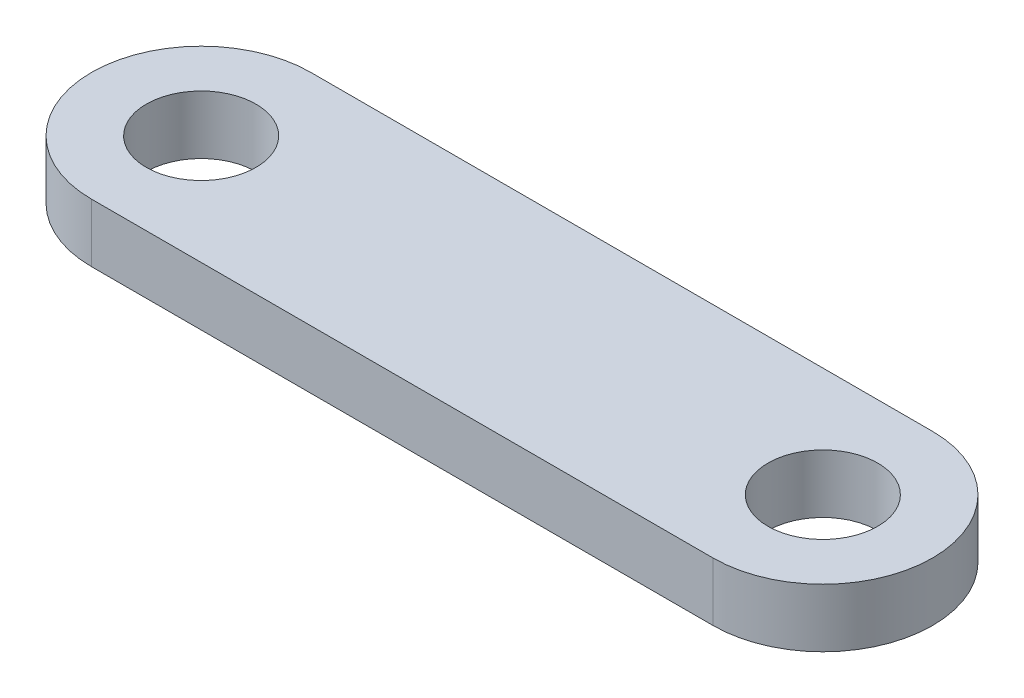
ISO-10303-21;
HEADER;
FILE_DESCRIPTION(('STEP AP214'),'2;1');
FILE_NAME('part.step','',(''),(''),'','','');
FILE_SCHEMA(('AUTOMOTIVE_DESIGN { 1 0 10303 214 1 1 1 1 }'));
ENDSEC;
DATA;
#1=APPLICATION_CONTEXT('core data for automotive mechanical design processes');
#2=APPLICATION_PROTOCOL_DEFINITION('international standard','automotive_design',2000,#1);
#3=PRODUCT_CONTEXT('',#1,'mechanical');
#4=PRODUCT('Part','Part','',(#3));
#5=PRODUCT_RELATED_PRODUCT_CATEGORY('part','',(#4));
#6=PRODUCT_DEFINITION_FORMATION('','',#4);
#7=PRODUCT_DEFINITION_CONTEXT('part definition',#1,'design');
#8=PRODUCT_DEFINITION('design','',#6,#7);
#9=PRODUCT_DEFINITION_SHAPE('','',#8);
#10=(LENGTH_UNIT() NAMED_UNIT(*) SI_UNIT(.MILLI.,.METRE.));
#11=(NAMED_UNIT(*) PLANE_ANGLE_UNIT() SI_UNIT($,.RADIAN.));
#12=(NAMED_UNIT(*) SI_UNIT($,.STERADIAN.) SOLID_ANGLE_UNIT());
#13=UNCERTAINTY_MEASURE_WITH_UNIT(LENGTH_MEASURE(1.E-05),#10,'distance_accuracy_value','');
#14=(GEOMETRIC_REPRESENTATION_CONTEXT(3) GLOBAL_UNCERTAINTY_ASSIGNED_CONTEXT((#13)) GLOBAL_UNIT_ASSIGNED_CONTEXT((#10,
#11,#12)) REPRESENTATION_CONTEXT('',''));
#15=CARTESIAN_POINT('',(0.,0.,0.));
#16=DIRECTION('',(0.,0.,1.));
#17=DIRECTION('',(1.,0.,0.));
#18=AXIS2_PLACEMENT_3D('',#15,#16,#17);
#19=CARTESIAN_POINT('',(-107.95,10.16,0.));
#20=DIRECTION('',(0.,1.,0.));
#21=DIRECTION('',(0.,0.,1.));
#22=AXIS2_PLACEMENT_3D('',#19,#20,#21);
#23=PLANE('',#22);
#24=CARTESIAN_POINT('',(-107.95,10.16,0.));
#25=DIRECTION('',(0.,1.,0.));
#26=DIRECTION('',(0.,0.,1.));
#27=AXIS2_PLACEMENT_3D('',#24,#25,#26);
#28=CIRCLE('',#27,9.52500000000001);
#29=CARTESIAN_POINT('',(-107.95,10.16,9.52500000000002));
#30=VERTEX_POINT('',#29);
#31=EDGE_CURVE('E113',#30,#30,#28,.T.);
#32=ORIENTED_EDGE('',*,*,#31,.F.);
#33=EDGE_LOOP('',(#32));
#34=FACE_BOUND('',#33,.T.);
#35=CARTESIAN_POINT('',(-107.95,10.16,0.));
#36=DIRECTION('',(0.,1.,0.));
#37=DIRECTION('',(0.,0.,1.));
#38=AXIS2_PLACEMENT_3D('',#35,#36,#37);
#39=CIRCLE('',#38,19.05);
#40=CARTESIAN_POINT('',(-107.95,10.16,-19.05));
#41=VERTEX_POINT('',#40);
#42=CARTESIAN_POINT('',(-107.95,10.16,19.05));
#43=VERTEX_POINT('',#42);
#44=EDGE_CURVE('E98',#41,#43,#39,.T.);
#45=ORIENTED_EDGE('',*,*,#44,.T.);
#46=DIRECTION('',(1.,0.,0.));
#47=VECTOR('',#46,1.);
#48=CARTESIAN_POINT('',(-107.95,10.16,19.05));
#49=LINE('',#48,#47);
#50=CARTESIAN_POINT('',(0.,10.16,19.05));
#51=VERTEX_POINT('',#50);
#52=EDGE_CURVE('E93',#43,#51,#49,.T.);
#53=ORIENTED_EDGE('',*,*,#52,.T.);
#54=CARTESIAN_POINT('',(0.,10.16,0.));
#55=DIRECTION('',(0.,1.,0.));
#56=DIRECTION('',(0.,0.,1.));
#57=AXIS2_PLACEMENT_3D('',#54,#55,#56);
#58=CIRCLE('',#57,19.05);
#59=CARTESIAN_POINT('',(0.,10.16,-19.05));
#60=VERTEX_POINT('',#59);
#61=EDGE_CURVE('E96',#51,#60,#58,.T.);
#62=ORIENTED_EDGE('',*,*,#61,.T.);
#63=DIRECTION('',(-1.,0.,0.));
#64=VECTOR('',#63,1.);
#65=CARTESIAN_POINT('',(-107.95,10.16,-19.05));
#66=LINE('',#65,#64);
#67=EDGE_CURVE('E63',#60,#41,#66,.T.);
#68=ORIENTED_EDGE('',*,*,#67,.T.);
#69=EDGE_LOOP('',(#45,#53,#62,#68));
#70=FACE_BOUND('',#69,.T.);
#71=CARTESIAN_POINT('',(0.,10.16,0.));
#72=DIRECTION('',(0.,1.,0.));
#73=DIRECTION('',(0.,0.,1.));
#74=AXIS2_PLACEMENT_3D('',#71,#72,#73);
#75=CIRCLE('',#74,9.525);
#76=CARTESIAN_POINT('',(0.,10.16,9.525));
#77=VERTEX_POINT('',#76);
#78=EDGE_CURVE('E128',#77,#77,#75,.T.);
#79=ORIENTED_EDGE('',*,*,#78,.F.);
#80=EDGE_LOOP('',(#79));
#81=FACE_BOUND('',#80,.T.);
#82=ADVANCED_FACE('F46',(#34,#70,#81),#23,.T.);
#83=CARTESIAN_POINT('',(-107.95,0.,0.));
#84=DIRECTION('',(0.,1.,0.));
#85=DIRECTION('',(0.,0.,1.));
#86=AXIS2_PLACEMENT_3D('',#83,#84,#85);
#87=PLANE('',#86);
#88=CARTESIAN_POINT('',(-107.95,0.,0.));
#89=DIRECTION('',(0.,1.,0.));
#90=DIRECTION('',(0.,0.,1.));
#91=AXIS2_PLACEMENT_3D('',#88,#89,#90);
#92=CIRCLE('',#91,19.05);
#93=CARTESIAN_POINT('',(-107.95,0.,-19.05));
#94=VERTEX_POINT('',#93);
#95=CARTESIAN_POINT('',(-107.95,0.,19.05));
#96=VERTEX_POINT('',#95);
#97=EDGE_CURVE('E110',#94,#96,#92,.T.);
#98=ORIENTED_EDGE('',*,*,#97,.F.);
#99=DIRECTION('',(-1.,0.,0.));
#100=VECTOR('',#99,1.);
#101=CARTESIAN_POINT('',(-107.95,0.,-19.05));
#102=LINE('',#101,#100);
#103=CARTESIAN_POINT('',(0.,0.,-19.05));
#104=VERTEX_POINT('',#103);
#105=EDGE_CURVE('E86',#104,#94,#102,.T.);
#106=ORIENTED_EDGE('',*,*,#105,.F.);
#107=CARTESIAN_POINT('',(0.,0.,0.));
#108=DIRECTION('',(0.,1.,0.));
#109=DIRECTION('',(0.,0.,1.));
#110=AXIS2_PLACEMENT_3D('',#107,#108,#109);
#111=CIRCLE('',#110,19.05);
#112=CARTESIAN_POINT('',(0.,0.,19.05));
#113=VERTEX_POINT('',#112);
#114=EDGE_CURVE('E80',#113,#104,#111,.T.);
#115=ORIENTED_EDGE('',*,*,#114,.F.);
#116=DIRECTION('',(1.,0.,0.));
#117=VECTOR('',#116,1.);
#118=CARTESIAN_POINT('',(-107.95,0.,19.05));
#119=LINE('',#118,#117);
#120=EDGE_CURVE('E102',#96,#113,#119,.T.);
#121=ORIENTED_EDGE('',*,*,#120,.F.);
#122=EDGE_LOOP('',(#98,#106,#115,#121));
#123=FACE_BOUND('',#122,.T.);
#124=CARTESIAN_POINT('',(-107.95,0.,0.));
#125=DIRECTION('',(0.,1.,0.));
#126=DIRECTION('',(0.,0.,1.));
#127=AXIS2_PLACEMENT_3D('',#124,#125,#126);
#128=CIRCLE('',#127,9.52500000000001);
#129=CARTESIAN_POINT('',(-107.95,0.,9.52500000000002));
#130=VERTEX_POINT('',#129);
#131=EDGE_CURVE('E125',#130,#130,#128,.T.);
#132=ORIENTED_EDGE('',*,*,#131,.T.);
#133=EDGE_LOOP('',(#132));
#134=FACE_BOUND('',#133,.T.);
#135=CARTESIAN_POINT('',(0.,0.,0.));
#136=DIRECTION('',(0.,1.,0.));
#137=DIRECTION('',(0.,0.,1.));
#138=AXIS2_PLACEMENT_3D('',#135,#136,#137);
#139=CIRCLE('',#138,9.525);
#140=CARTESIAN_POINT('',(0.,0.,9.525));
#141=VERTEX_POINT('',#140);
#142=EDGE_CURVE('E131',#141,#141,#139,.T.);
#143=ORIENTED_EDGE('',*,*,#142,.T.);
#144=EDGE_LOOP('',(#143));
#145=FACE_BOUND('',#144,.T.);
#146=ADVANCED_FACE('F121',(#123,#134,#145),#87,.F.);
#147=CARTESIAN_POINT('',(-107.95,10.16,0.));
#148=DIRECTION('',(0.,-1.,0.));
#149=DIRECTION('',(0.,0.,-1.));
#150=AXIS2_PLACEMENT_3D('',#147,#148,#149);
#151=CYLINDRICAL_SURFACE('',#150,19.05);
#152=ORIENTED_EDGE('',*,*,#97,.T.);
#153=DIRECTION('',(0.,-1.,0.));
#154=VECTOR('',#153,1.);
#155=CARTESIAN_POINT('',(-107.95,10.16,19.05));
#156=LINE('',#155,#154);
#157=EDGE_CURVE('E13',#43,#96,#156,.T.);
#158=ORIENTED_EDGE('',*,*,#157,.F.);
#159=ORIENTED_EDGE('',*,*,#44,.F.);
#160=DIRECTION('',(0.,-1.,0.));
#161=VECTOR('',#160,1.);
#162=CARTESIAN_POINT('',(-107.95,10.16,-19.05));
#163=LINE('',#162,#161);
#164=EDGE_CURVE('E106',#41,#94,#163,.T.);
#165=ORIENTED_EDGE('',*,*,#164,.T.);
#166=EDGE_LOOP('',(#152,#158,#159,#165));
#167=FACE_BOUND('',#166,.T.);
#168=ADVANCED_FACE('F48',(#167),#151,.T.);
#169=CARTESIAN_POINT('',(-107.95,10.16,19.05));
#170=DIRECTION('',(0.,0.,-1.));
#171=DIRECTION('',(-1.,0.,0.));
#172=AXIS2_PLACEMENT_3D('',#169,#170,#171);
#173=PLANE('',#172);
#174=ORIENTED_EDGE('',*,*,#120,.T.);
#175=DIRECTION('',(0.,-1.,0.));
#176=VECTOR('',#175,1.);
#177=CARTESIAN_POINT('',(0.,10.16,19.05));
#178=LINE('',#177,#176);
#179=EDGE_CURVE('E55',#51,#113,#178,.T.);
#180=ORIENTED_EDGE('',*,*,#179,.F.);
#181=ORIENTED_EDGE('',*,*,#52,.F.);
#182=ORIENTED_EDGE('',*,*,#157,.T.);
#183=EDGE_LOOP('',(#174,#180,#181,#182));
#184=FACE_BOUND('',#183,.T.);
#185=ADVANCED_FACE('F101',(#184),#173,.F.);
#186=CARTESIAN_POINT('',(0.,10.16,0.));
#187=DIRECTION('',(0.,-1.,0.));
#188=DIRECTION('',(0.,0.,-1.));
#189=AXIS2_PLACEMENT_3D('',#186,#187,#188);
#190=CYLINDRICAL_SURFACE('',#189,19.05);
#191=ORIENTED_EDGE('',*,*,#114,.T.);
#192=DIRECTION('',(0.,-1.,0.));
#193=VECTOR('',#192,1.);
#194=CARTESIAN_POINT('',(0.,10.16,-19.05));
#195=LINE('',#194,#193);
#196=EDGE_CURVE('E103',#60,#104,#195,.T.);
#197=ORIENTED_EDGE('',*,*,#196,.F.);
#198=ORIENTED_EDGE('',*,*,#61,.F.);
#199=ORIENTED_EDGE('',*,*,#179,.T.);
#200=EDGE_LOOP('',(#191,#197,#198,#199));
#201=FACE_BOUND('',#200,.T.);
#202=ADVANCED_FACE('F104',(#201),#190,.T.);
#203=CARTESIAN_POINT('',(-107.95,10.16,-19.05));
#204=DIRECTION('',(0.,0.,1.));
#205=DIRECTION('',(1.,0.,0.));
#206=AXIS2_PLACEMENT_3D('',#203,#204,#205);
#207=PLANE('',#206);
#208=ORIENTED_EDGE('',*,*,#105,.T.);
#209=ORIENTED_EDGE('',*,*,#164,.F.);
#210=ORIENTED_EDGE('',*,*,#67,.F.);
#211=ORIENTED_EDGE('',*,*,#196,.T.);
#212=EDGE_LOOP('',(#208,#209,#210,#211));
#213=FACE_BOUND('',#212,.T.);
#214=ADVANCED_FACE('F118',(#213),#207,.F.);
#215=CARTESIAN_POINT('',(-107.95,10.16,0.));
#216=DIRECTION('',(0.,-1.,0.));
#217=DIRECTION('',(0.,0.,-1.));
#218=AXIS2_PLACEMENT_3D('',#215,#216,#217);
#219=CYLINDRICAL_SURFACE('',#218,9.52500000000001);
#220=ORIENTED_EDGE('',*,*,#31,.T.);
#221=EDGE_LOOP('',(#220));
#222=FACE_BOUND('',#221,.T.);
#223=ORIENTED_EDGE('',*,*,#131,.F.);
#224=EDGE_LOOP('',(#223));
#225=FACE_BOUND('',#224,.T.);
#226=ADVANCED_FACE('F148',(#222,#225),#219,.F.);
#227=CARTESIAN_POINT('',(0.,10.16,0.));
#228=DIRECTION('',(0.,-1.,0.));
#229=DIRECTION('',(0.,0.,-1.));
#230=AXIS2_PLACEMENT_3D('',#227,#228,#229);
#231=CYLINDRICAL_SURFACE('',#230,9.525);
#232=ORIENTED_EDGE('',*,*,#78,.T.);
#233=EDGE_LOOP('',(#232));
#234=FACE_BOUND('',#233,.T.);
#235=ORIENTED_EDGE('',*,*,#142,.F.);
#236=EDGE_LOOP('',(#235));
#237=FACE_BOUND('',#236,.T.);
#238=ADVANCED_FACE('F137',(#234,#237),#231,.F.);
#239=CLOSED_SHELL('',(#82,#146,#168,#185,#202,#214,#226,#238));
#240=MANIFOLD_SOLID_BREP('B2',#239);
#241=ADVANCED_BREP_SHAPE_REPRESENTATION('',(#18,#240),#14);
#242=SHAPE_DEFINITION_REPRESENTATION(#9,#241);
ENDSEC;
END-ISO-10303-21;
